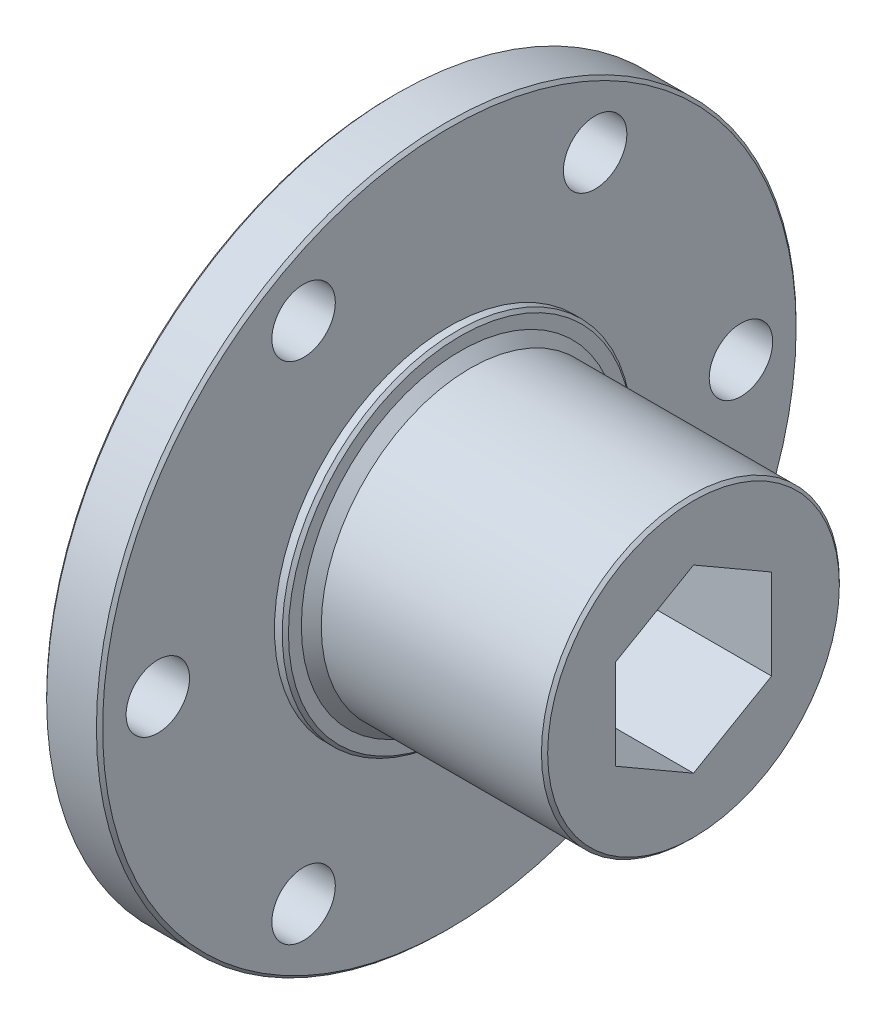
ISO-10303-21;
HEADER;
FILE_DESCRIPTION(('STEP AP214'),'2;1');
FILE_NAME('part.step','',(''),(''),'','','');
FILE_SCHEMA(('AUTOMOTIVE_DESIGN { 1 0 10303 214 1 1 1 1 }'));
ENDSEC;
DATA;
#1=APPLICATION_CONTEXT('core data for automotive mechanical design processes');
#2=APPLICATION_PROTOCOL_DEFINITION('international standard','automotive_design',2000,#1);
#3=PRODUCT_CONTEXT('',#1,'mechanical');
#4=PRODUCT('Part','Part','',(#3));
#5=PRODUCT_RELATED_PRODUCT_CATEGORY('part','',(#4));
#6=PRODUCT_DEFINITION_FORMATION('','',#4);
#7=PRODUCT_DEFINITION_CONTEXT('part definition',#1,'design');
#8=PRODUCT_DEFINITION('design','',#6,#7);
#9=PRODUCT_DEFINITION_SHAPE('','',#8);
#10=(LENGTH_UNIT() NAMED_UNIT(*) SI_UNIT(.MILLI.,.METRE.));
#11=(NAMED_UNIT(*) PLANE_ANGLE_UNIT() SI_UNIT($,.RADIAN.));
#12=(NAMED_UNIT(*) SI_UNIT($,.STERADIAN.) SOLID_ANGLE_UNIT());
#13=UNCERTAINTY_MEASURE_WITH_UNIT(LENGTH_MEASURE(1.E-05),#10,'distance_accuracy_value','');
#14=(GEOMETRIC_REPRESENTATION_CONTEXT(3) GLOBAL_UNCERTAINTY_ASSIGNED_CONTEXT((#13)) GLOBAL_UNIT_ASSIGNED_CONTEXT((#10,
#11,#12)) REPRESENTATION_CONTEXT('',''));
#15=CARTESIAN_POINT('',(0.,0.,0.));
#16=DIRECTION('',(0.,0.,1.));
#17=DIRECTION('',(1.,0.,0.));
#18=AXIS2_PLACEMENT_3D('',#15,#16,#17);
#19=CARTESIAN_POINT('',(-13.9240662460568,0.,0.));
#20=DIRECTION('',(-1.,0.,0.));
#21=DIRECTION('',(0.,0.,1.));
#22=AXIS2_PLACEMENT_3D('',#19,#20,#21);
#23=CYLINDRICAL_SURFACE('',#22,28.575);
#24=CARTESIAN_POINT('',(-18.2420662460566,0.,0.));
#25=DIRECTION('',(-1.,0.,0.));
#26=DIRECTION('',(0.,0.,1.));
#27=AXIS2_PLACEMENT_3D('',#24,#25,#26);
#28=CIRCLE('',#27,28.575);
#29=CARTESIAN_POINT('',(-18.2420662460566,0.,28.575));
#30=VERTEX_POINT('',#29);
#31=EDGE_CURVE('E169',#30,#30,#28,.F.);
#32=ORIENTED_EDGE('',*,*,#31,.T.);
#33=EDGE_LOOP('',(#32));
#34=FACE_BOUND('',#33,.T.);
#35=CARTESIAN_POINT('',(-14.1780662460569,0.,0.));
#36=DIRECTION('',(1.,0.,0.));
#37=DIRECTION('',(0.,0.,-1.));
#38=AXIS2_PLACEMENT_3D('',#35,#36,#37);
#39=CIRCLE('',#38,28.575);
#40=CARTESIAN_POINT('',(-14.1780662460569,0.,-28.575));
#41=VERTEX_POINT('',#40);
#42=EDGE_CURVE('E166',#41,#41,#39,.F.);
#43=ORIENTED_EDGE('',*,*,#42,.T.);
#44=EDGE_LOOP('',(#43));
#45=FACE_BOUND('',#44,.T.);
#46=ADVANCED_FACE('F32',(#34,#45),#23,.T.);
#47=CARTESIAN_POINT('',(-13.9240662460568,28.575,0.));
#48=DIRECTION('',(1.,0.,0.));
#49=DIRECTION('',(0.,0.,-1.));
#50=AXIS2_PLACEMENT_3D('',#47,#48,#49);
#51=PLANE('',#50);
#52=CARTESIAN_POINT('',(-13.9240662460568,0.,0.));
#53=DIRECTION('',(1.,0.,0.));
#54=DIRECTION('',(0.,0.,-1.));
#55=AXIS2_PLACEMENT_3D('',#52,#53,#54);
#56=CIRCLE('',#55,28.3209999999999);
#57=CARTESIAN_POINT('',(-13.9240662460568,0.,-28.3209999999999));
#58=VERTEX_POINT('',#57);
#59=EDGE_CURVE('E11',#58,#58,#56,.T.);
#60=ORIENTED_EDGE('',*,*,#59,.T.);
#61=EDGE_LOOP('',(#60));
#62=FACE_BOUND('',#61,.T.);
#63=CARTESIAN_POINT('',(-13.9240662460568,20.6222299276169,11.90625));
#64=DIRECTION('',(1.,0.,0.));
#65=DIRECTION('',(0.,0.,-1.));
#66=AXIS2_PLACEMENT_3D('',#63,#64,#65);
#67=CIRCLE('',#66,2.59080000000003);
#68=CARTESIAN_POINT('',(-13.9240662460568,20.6222299276169,9.31544999999998));
#69=VERTEX_POINT('',#68);
#70=EDGE_CURVE('E321',#69,#69,#67,.T.);
#71=ORIENTED_EDGE('',*,*,#70,.F.);
#72=EDGE_LOOP('',(#71));
#73=FACE_BOUND('',#72,.T.);
#74=CARTESIAN_POINT('',(-13.9240662460568,0.,-23.8125));
#75=DIRECTION('',(1.,0.,0.));
#76=DIRECTION('',(0.,0.,-1.));
#77=AXIS2_PLACEMENT_3D('',#74,#75,#76);
#78=CIRCLE('',#77,2.59080000000003);
#79=CARTESIAN_POINT('',(-13.9240662460568,0.,-26.4033));
#80=VERTEX_POINT('',#79);
#81=EDGE_CURVE('E326',#80,#80,#78,.T.);
#82=ORIENTED_EDGE('',*,*,#81,.F.);
#83=EDGE_LOOP('',(#82));
#84=FACE_BOUND('',#83,.T.);
#85=CARTESIAN_POINT('',(-13.9240662460568,-20.622229927617,11.9062499999999));
#86=DIRECTION('',(1.,0.,0.));
#87=DIRECTION('',(0.,0.,-1.));
#88=AXIS2_PLACEMENT_3D('',#85,#86,#87);
#89=CIRCLE('',#88,2.59080000000003);
#90=CARTESIAN_POINT('',(-13.9240662460568,-20.622229927617,9.31544999999992));
#91=VERTEX_POINT('',#90);
#92=EDGE_CURVE('E330',#91,#91,#89,.T.);
#93=ORIENTED_EDGE('',*,*,#92,.F.);
#94=EDGE_LOOP('',(#93));
#95=FACE_BOUND('',#94,.T.);
#96=CARTESIAN_POINT('',(-13.9240662460568,-20.6222299276169,-11.90625));
#97=DIRECTION('',(1.,0.,0.));
#98=DIRECTION('',(0.,0.,-1.));
#99=AXIS2_PLACEMENT_3D('',#96,#97,#98);
#100=CIRCLE('',#99,2.59080000000003);
#101=CARTESIAN_POINT('',(-13.9240662460568,-20.6222299276169,-14.4970500000001));
#102=VERTEX_POINT('',#101);
#103=EDGE_CURVE('E334',#102,#102,#100,.T.);
#104=ORIENTED_EDGE('',*,*,#103,.F.);
#105=EDGE_LOOP('',(#104));
#106=FACE_BOUND('',#105,.T.);
#107=CARTESIAN_POINT('',(-13.9240662460568,20.622229927617,-11.90625));
#108=DIRECTION('',(1.,0.,0.));
#109=DIRECTION('',(0.,0.,-1.));
#110=AXIS2_PLACEMENT_3D('',#107,#108,#109);
#111=CIRCLE('',#110,2.59080000000003);
#112=CARTESIAN_POINT('',(-13.9240662460568,20.622229927617,-14.49705));
#113=VERTEX_POINT('',#112);
#114=EDGE_CURVE('E338',#113,#113,#111,.T.);
#115=ORIENTED_EDGE('',*,*,#114,.F.);
#116=EDGE_LOOP('',(#115));
#117=FACE_BOUND('',#116,.T.);
#118=CARTESIAN_POINT('',(-13.9240662460568,0.,23.8125));
#119=DIRECTION('',(1.,0.,0.));
#120=DIRECTION('',(0.,0.,-1.));
#121=AXIS2_PLACEMENT_3D('',#118,#119,#120);
#122=CIRCLE('',#121,2.59080000000003);
#123=CARTESIAN_POINT('',(-13.9240662460568,0.,21.2217));
#124=VERTEX_POINT('',#123);
#125=EDGE_CURVE('E109',#124,#124,#122,.T.);
#126=ORIENTED_EDGE('',*,*,#125,.F.);
#127=EDGE_LOOP('',(#126));
#128=FACE_BOUND('',#127,.T.);
#129=CARTESIAN_POINT('',(-13.9240662460568,0.,0.));
#130=DIRECTION('',(1.,0.,0.));
#131=DIRECTION('',(0.,0.,-1.));
#132=AXIS2_PLACEMENT_3D('',#129,#130,#131);
#133=CIRCLE('',#132,14.2875);
#134=CARTESIAN_POINT('',(-13.9240662460568,0.,-14.2875));
#135=VERTEX_POINT('',#134);
#136=EDGE_CURVE('E148',#135,#135,#133,.T.);
#137=ORIENTED_EDGE('',*,*,#136,.F.);
#138=EDGE_LOOP('',(#137));
#139=FACE_BOUND('',#138,.T.);
#140=ADVANCED_FACE('F204',(#62,#73,#84,#95,#106,#117,#128,#139),#51,.T.);
#141=CARTESIAN_POINT('',(-18.4960662460568,0.,0.));
#142=DIRECTION('',(-1.,0.,0.));
#143=DIRECTION('',(0.,0.,1.));
#144=AXIS2_PLACEMENT_3D('',#141,#142,#143);
#145=PLANE('',#144);
#146=CARTESIAN_POINT('',(-18.4960662460568,0.,0.));
#147=DIRECTION('',(-1.,0.,0.));
#148=DIRECTION('',(0.,0.,1.));
#149=AXIS2_PLACEMENT_3D('',#146,#147,#148);
#150=CIRCLE('',#149,28.3209999999999);
#151=CARTESIAN_POINT('',(-18.4960662460568,0.,28.3209999999999));
#152=VERTEX_POINT('',#151);
#153=EDGE_CURVE('E163',#152,#152,#150,.T.);
#154=ORIENTED_EDGE('',*,*,#153,.T.);
#155=EDGE_LOOP('',(#154));
#156=FACE_BOUND('',#155,.T.);
#157=CARTESIAN_POINT('',(-18.4960662460568,20.6222299276169,11.90625));
#158=DIRECTION('',(-1.,0.,0.));
#159=DIRECTION('',(0.,0.,1.));
#160=AXIS2_PLACEMENT_3D('',#157,#158,#159);
#161=CIRCLE('',#160,2.59080000000003);
#162=CARTESIAN_POINT('',(-18.4960662460568,20.6222299276169,14.49705));
#163=VERTEX_POINT('',#162);
#164=EDGE_CURVE('E238',#163,#163,#161,.T.);
#165=ORIENTED_EDGE('',*,*,#164,.F.);
#166=EDGE_LOOP('',(#165));
#167=FACE_BOUND('',#166,.T.);
#168=CARTESIAN_POINT('',(-18.4960662460568,0.,-23.8125));
#169=DIRECTION('',(-1.,0.,0.));
#170=DIRECTION('',(0.,0.,1.));
#171=AXIS2_PLACEMENT_3D('',#168,#169,#170);
#172=CIRCLE('',#171,2.59080000000003);
#173=CARTESIAN_POINT('',(-18.4960662460568,0.,-21.2217));
#174=VERTEX_POINT('',#173);
#175=EDGE_CURVE('E242',#174,#174,#172,.T.);
#176=ORIENTED_EDGE('',*,*,#175,.F.);
#177=EDGE_LOOP('',(#176));
#178=FACE_BOUND('',#177,.T.);
#179=CARTESIAN_POINT('',(-18.4960662460568,-20.622229927617,11.9062499999999));
#180=DIRECTION('',(-1.,0.,0.));
#181=DIRECTION('',(0.,0.,1.));
#182=AXIS2_PLACEMENT_3D('',#179,#180,#181);
#183=CIRCLE('',#182,2.59080000000003);
#184=CARTESIAN_POINT('',(-18.4960662460568,-20.622229927617,14.49705));
#185=VERTEX_POINT('',#184);
#186=EDGE_CURVE('E246',#185,#185,#183,.T.);
#187=ORIENTED_EDGE('',*,*,#186,.F.);
#188=EDGE_LOOP('',(#187));
#189=FACE_BOUND('',#188,.T.);
#190=CARTESIAN_POINT('',(-18.4960662460568,-20.6222299276169,-11.90625));
#191=DIRECTION('',(-1.,0.,0.));
#192=DIRECTION('',(0.,0.,1.));
#193=AXIS2_PLACEMENT_3D('',#190,#191,#192);
#194=CIRCLE('',#193,2.59080000000003);
#195=CARTESIAN_POINT('',(-18.4960662460568,-20.6222299276169,-9.31545000000002));
#196=VERTEX_POINT('',#195);
#197=EDGE_CURVE('E250',#196,#196,#194,.T.);
#198=ORIENTED_EDGE('',*,*,#197,.F.);
#199=EDGE_LOOP('',(#198));
#200=FACE_BOUND('',#199,.T.);
#201=CARTESIAN_POINT('',(-18.4960662460568,20.622229927617,-11.90625));
#202=DIRECTION('',(-1.,0.,0.));
#203=DIRECTION('',(0.,0.,1.));
#204=AXIS2_PLACEMENT_3D('',#201,#202,#203);
#205=CIRCLE('',#204,2.59080000000003);
#206=CARTESIAN_POINT('',(-18.4960662460568,20.622229927617,-9.31544999999995));
#207=VERTEX_POINT('',#206);
#208=EDGE_CURVE('E254',#207,#207,#205,.T.);
#209=ORIENTED_EDGE('',*,*,#208,.F.);
#210=EDGE_LOOP('',(#209));
#211=FACE_BOUND('',#210,.T.);
#212=CARTESIAN_POINT('',(-18.4960662460568,0.,23.8125));
#213=DIRECTION('',(-1.,0.,0.));
#214=DIRECTION('',(0.,0.,1.));
#215=AXIS2_PLACEMENT_3D('',#212,#213,#214);
#216=CIRCLE('',#215,2.59080000000003);
#217=CARTESIAN_POINT('',(-18.4960662460568,0.,26.4033));
#218=VERTEX_POINT('',#217);
#219=EDGE_CURVE('E258',#218,#218,#216,.T.);
#220=ORIENTED_EDGE('',*,*,#219,.F.);
#221=EDGE_LOOP('',(#220));
#222=FACE_BOUND('',#221,.T.);
#223=CARTESIAN_POINT('',(-18.4960662460568,0.,0.));
#224=DIRECTION('',(-1.,0.,0.));
#225=DIRECTION('',(0.,0.,1.));
#226=AXIS2_PLACEMENT_3D('',#223,#224,#225);
#227=CIRCLE('',#226,14.2875);
#228=CARTESIAN_POINT('',(-18.4960662460568,0.,14.2875));
#229=VERTEX_POINT('',#228);
#230=EDGE_CURVE('E132',#229,#229,#227,.T.);
#231=ORIENTED_EDGE('',*,*,#230,.F.);
#232=EDGE_LOOP('',(#231));
#233=FACE_BOUND('',#232,.T.);
#234=ADVANCED_FACE('F210',(#156,#167,#178,#189,#200,#211,#222,#233),#145,.T.);
#235=CARTESIAN_POINT('',(-13.0350662460568,0.,0.));
#236=DIRECTION('',(-1.,0.,0.));
#237=DIRECTION('',(0.,0.,1.));
#238=AXIS2_PLACEMENT_3D('',#235,#236,#237);
#239=CYLINDRICAL_SURFACE('',#238,14.2875);
#240=CARTESIAN_POINT('',(-13.2890662460569,0.,0.));
#241=DIRECTION('',(1.,0.,0.));
#242=DIRECTION('',(0.,0.,-1.));
#243=AXIS2_PLACEMENT_3D('',#240,#241,#242);
#244=CIRCLE('',#243,14.2875);
#245=CARTESIAN_POINT('',(-13.2890662460569,0.,-14.2875));
#246=VERTEX_POINT('',#245);
#247=EDGE_CURVE('E40',#246,#246,#244,.F.);
#248=ORIENTED_EDGE('',*,*,#247,.T.);
#249=EDGE_LOOP('',(#248));
#250=FACE_BOUND('',#249,.T.);
#251=ORIENTED_EDGE('',*,*,#136,.T.);
#252=EDGE_LOOP('',(#251));
#253=FACE_BOUND('',#252,.T.);
#254=ADVANCED_FACE('F177',(#250,#253),#239,.T.);
#255=CARTESIAN_POINT('',(-13.0350662460568,0.,0.));
#256=DIRECTION('',(1.,0.,0.));
#257=DIRECTION('',(0.,0.,-1.));
#258=AXIS2_PLACEMENT_3D('',#255,#256,#257);
#259=PLANE('',#258);
#260=CARTESIAN_POINT('',(-13.0350662460568,0.,0.));
#261=DIRECTION('',(1.,0.,0.));
#262=DIRECTION('',(0.,0.,-1.));
#263=AXIS2_PLACEMENT_3D('',#260,#261,#262);
#264=CIRCLE('',#263,14.0334999999999);
#265=CARTESIAN_POINT('',(-13.0350662460568,0.,-14.0334999999999));
#266=VERTEX_POINT('',#265);
#267=EDGE_CURVE('E172',#266,#266,#264,.T.);
#268=ORIENTED_EDGE('',*,*,#267,.T.);
#269=EDGE_LOOP('',(#268));
#270=FACE_BOUND('',#269,.T.);
#271=CARTESIAN_POINT('',(-13.0350662460568,0.,0.));
#272=DIRECTION('',(1.,0.,0.));
#273=DIRECTION('',(0.,0.,-1.));
#274=AXIS2_PLACEMENT_3D('',#271,#272,#273);
#275=CIRCLE('',#274,12.9794);
#276=CARTESIAN_POINT('',(-13.0350662460568,0.,-12.9794));
#277=VERTEX_POINT('',#276);
#278=EDGE_CURVE('E142',#277,#277,#275,.T.);
#279=ORIENTED_EDGE('',*,*,#278,.F.);
#280=EDGE_LOOP('',(#279));
#281=FACE_BOUND('',#280,.T.);
#282=ADVANCED_FACE('F186',(#270,#281),#259,.T.);
#283=CARTESIAN_POINT('',(-13.0350662460568,0.,0.));
#284=DIRECTION('',(-1.,0.,0.));
#285=DIRECTION('',(0.,0.,-1.));
#286=AXIS2_PLACEMENT_3D('',#283,#284,#285);
#287=CONICAL_SURFACE('',#286,12.9794,0.785398163397434);
#288=CARTESIAN_POINT('',(-12.2222662460567,0.,0.));
#289=DIRECTION('',(1.,0.,0.));
#290=DIRECTION('',(0.,0.,-1.));
#291=AXIS2_PLACEMENT_3D('',#288,#289,#290);
#292=CIRCLE('',#291,12.1666);
#293=CARTESIAN_POINT('',(-12.2222662460567,0.,12.1666));
#294=VERTEX_POINT('',#293);
#295=EDGE_CURVE('E145',#294,#294,#292,.T.);
#296=ORIENTED_EDGE('',*,*,#295,.F.);
#297=EDGE_LOOP('',(#296));
#298=FACE_BOUND('',#297,.T.);
#299=ORIENTED_EDGE('',*,*,#278,.T.);
#300=EDGE_LOOP('',(#299));
#301=FACE_BOUND('',#300,.T.);
#302=ADVANCED_FACE('F189',(#298,#301),#287,.T.);
#303=CARTESIAN_POINT('',(6.01493375394323,0.,0.));
#304=DIRECTION('',(-1.,0.,0.));
#305=DIRECTION('',(0.,0.,1.));
#306=AXIS2_PLACEMENT_3D('',#303,#304,#305);
#307=CYLINDRICAL_SURFACE('',#306,12.1666);
#308=CARTESIAN_POINT('',(5.76093375394317,0.,0.));
#309=DIRECTION('',(1.,0.,0.));
#310=DIRECTION('',(0.,0.,-1.));
#311=AXIS2_PLACEMENT_3D('',#308,#309,#310);
#312=CIRCLE('',#311,12.1666);
#313=CARTESIAN_POINT('',(5.76093375394317,0.,12.1666));
#314=VERTEX_POINT('',#313);
#315=EDGE_CURVE('E160',#314,#314,#312,.F.);
#316=CARTESIAN_POINT('',(5.76093375394317,0.,12.1666));
#317=CARTESIAN_POINT('',(5.57360875394317,0.,12.1666));
#318=CARTESIAN_POINT('',(5.38628375394317,0.,12.1666));
#319=CARTESIAN_POINT('',(5.01163375394318,0.,12.1666));
#320=CARTESIAN_POINT('',(4.82430875394318,0.,12.1666));
#321=CARTESIAN_POINT('',(4.44965875394318,0.,12.1666));
#322=CARTESIAN_POINT('',(4.26233375394318,0.,12.1666));
#323=CARTESIAN_POINT('',(3.88768375394318,0.,12.1666));
#324=CARTESIAN_POINT('',(3.70035875394318,0.,12.1666));
#325=CARTESIAN_POINT('',(3.32570875394319,0.,12.1666));
#326=CARTESIAN_POINT('',(3.13838375394319,0.,12.1666));
#327=CARTESIAN_POINT('',(2.76373375394319,0.,12.1666));
#328=CARTESIAN_POINT('',(2.57640875394319,0.,12.1666));
#329=CARTESIAN_POINT('',(2.20175875394319,0.,12.1666));
#330=CARTESIAN_POINT('',(2.01443375394319,0.,12.1666));
#331=CARTESIAN_POINT('',(1.6397837539432,0.,12.1666));
#332=CARTESIAN_POINT('',(1.4524587539432,0.,12.1666));
#333=CARTESIAN_POINT('',(1.0778087539432,0.,12.1666));
#334=CARTESIAN_POINT('',(0.890483753943201,0.,12.1666));
#335=CARTESIAN_POINT('',(0.515833753943203,0.,12.1666));
#336=CARTESIAN_POINT('',(0.328508753943204,0.,12.1666));
#337=CARTESIAN_POINT('',(-0.0461412460567937,0.,12.1666));
#338=CARTESIAN_POINT('',(-0.233466246056793,0.,12.1666));
#339=CARTESIAN_POINT('',(-0.60811624605679,0.,12.1666));
#340=CARTESIAN_POINT('',(-0.795441246056789,0.,12.1666));
#341=CARTESIAN_POINT('',(-1.17009124605679,0.,12.1666));
#342=CARTESIAN_POINT('',(-1.35741624605678,0.,12.1666));
#343=CARTESIAN_POINT('',(-1.73206624605678,0.,12.1666));
#344=CARTESIAN_POINT('',(-1.91939124605678,0.,12.1666));
#345=CARTESIAN_POINT('',(-2.29404124605678,0.,12.1666));
#346=CARTESIAN_POINT('',(-2.48136624605678,0.,12.1666));
#347=CARTESIAN_POINT('',(-2.85601624605678,0.,12.1666));
#348=CARTESIAN_POINT('',(-3.04334124605677,0.,12.1666));
#349=CARTESIAN_POINT('',(-3.41799124605677,0.,12.1666));
#350=CARTESIAN_POINT('',(-3.60531624605677,0.,12.1666));
#351=CARTESIAN_POINT('',(-3.97996624605677,0.,12.1666));
#352=CARTESIAN_POINT('',(-4.16729124605677,0.,12.1666));
#353=CARTESIAN_POINT('',(-4.54194124605676,0.,12.1666));
#354=CARTESIAN_POINT('',(-4.72926624605676,0.,12.1666));
#355=CARTESIAN_POINT('',(-5.10391624605676,0.,12.1666));
#356=CARTESIAN_POINT('',(-5.29124124605676,0.,12.1666));
#357=CARTESIAN_POINT('',(-5.66589124605676,0.,12.1666));
#358=CARTESIAN_POINT('',(-5.85321624605676,0.,12.1666));
#359=CARTESIAN_POINT('',(-6.22786624605675,0.,12.1666));
#360=CARTESIAN_POINT('',(-6.41519124605675,0.,12.1666));
#361=CARTESIAN_POINT('',(-6.78984124605675,0.,12.1666));
#362=CARTESIAN_POINT('',(-6.97716624605675,0.,12.1666));
#363=CARTESIAN_POINT('',(-7.35181624605675,0.,12.1666));
#364=CARTESIAN_POINT('',(-7.53914124605675,0.,12.1666));
#365=CARTESIAN_POINT('',(-7.91379124605674,0.,12.1666));
#366=CARTESIAN_POINT('',(-8.10111624605674,0.,12.1666));
#367=CARTESIAN_POINT('',(-8.47576624605674,0.,12.1666));
#368=CARTESIAN_POINT('',(-8.66309124605674,0.,12.1666));
#369=CARTESIAN_POINT('',(-9.03774124605674,0.,12.1666));
#370=CARTESIAN_POINT('',(-9.22506624605674,0.,12.1666));
#371=CARTESIAN_POINT('',(-9.59971624605673,0.,12.1666));
#372=CARTESIAN_POINT('',(-9.78704124605673,0.,12.1666));
#373=CARTESIAN_POINT('',(-10.1616912460567,0.,12.1666));
#374=CARTESIAN_POINT('',(-10.3490162460567,0.,12.1666));
#375=CARTESIAN_POINT('',(-10.7236662460567,0.,12.1666));
#376=CARTESIAN_POINT('',(-10.9109912460567,0.,12.1666));
#377=CARTESIAN_POINT('',(-11.2856412460567,0.,12.1666));
#378=CARTESIAN_POINT('',(-11.4729662460567,0.,12.1666));
#379=CARTESIAN_POINT('',(-11.8476162460567,0.,12.1666));
#380=CARTESIAN_POINT('',(-12.0349412460567,0.,12.1666));
#381=CARTESIAN_POINT('',(-12.2222662460567,0.,12.1666));
#382=B_SPLINE_CURVE_WITH_KNOTS('',3,(#316,#317,#318,#319,#320,#321,#322,#323,#324,#325,#326,
#327,#328,#329,#330,#331,#332,#333,#334,#335,#336,#337,#338,#339,#340,#341,#342,#343,#344,#345,
#346,#347,#348,#349,#350,#351,#352,#353,#354,#355,#356,#357,#358,#359,#360,#361,#362,#363,#364,
#365,#366,#367,#368,#369,#370,#371,#372,#373,#374,#375,#376,#377,#378,#379,#380,#381),
.UNSPECIFIED.,.F.,.F.,(4,2,2,2,2,2,2,2,2,2,2,2,2,2,2,2,2,2,2,2,2,2,2,2,2,2,2,2,2,2,2,2,4),(0.,
0.561974999999996,1.12394999999999,1.68592499999999,2.24789999999999,2.80987499999998,
3.37184999999998,3.93382499999997,4.49579999999997,5.05777499999997,5.61974999999997,
6.18172499999996,6.74369999999996,7.30567499999995,7.86764999999995,8.42962499999995,
8.99159999999994,9.55357499999994,10.1155499999999,10.6775249999999,11.2394999999999,
11.8014749999999,12.3634499999999,12.9254249999999,13.4873999999999,14.0493749999999,
14.6113499999999,15.1733249999999,15.7352999999999,16.2972749999999,16.8592499999999,
17.4212249999999,17.9831999999999),.UNSPECIFIED.);
#383=EDGE_CURVE('BSEAM194',#314,#294,#382,.T.);
#384=ORIENTED_EDGE('',*,*,#315,.T.);
#385=ORIENTED_EDGE('',*,*,#295,.T.);
#386=ORIENTED_EDGE('',*,*,#383,.T.);
#387=ORIENTED_EDGE('',*,*,#383,.F.);
#388=EDGE_LOOP('',(#384,#386,#385,#387));
#389=FACE_BOUND('',#388,.T.);
#390=ADVANCED_FACE('F194',(#389),#307,.T.);
#391=CARTESIAN_POINT('',(6.01493375394323,0.,0.));
#392=DIRECTION('',(1.,0.,0.));
#393=DIRECTION('',(0.,0.,-1.));
#394=AXIS2_PLACEMENT_3D('',#391,#392,#393);
#395=PLANE('',#394);
#396=CARTESIAN_POINT('',(6.01493375394323,0.,0.));
#397=DIRECTION('',(1.,0.,0.));
#398=DIRECTION('',(0.,0.,-1.));
#399=AXIS2_PLACEMENT_3D('',#396,#397,#398);
#400=CIRCLE('',#399,11.9125999999999);
#401=CARTESIAN_POINT('',(6.01493375394323,0.,-11.9125999999999));
#402=VERTEX_POINT('',#401);
#403=EDGE_CURVE('E157',#402,#402,#400,.T.);
#404=ORIENTED_EDGE('',*,*,#403,.T.);
#405=EDGE_LOOP('',(#404));
#406=FACE_BOUND('',#405,.T.);
#407=DIRECTION('',(0.,0.500000000000001,-0.866025403784438));
#408=VECTOR('',#407,1.);
#409=CARTESIAN_POINT('',(6.01493375394323,3.68081890619155,6.3754));
#410=LINE('',#409,#408);
#411=CARTESIAN_POINT('',(6.01493375394323,3.68081890619155,6.3754));
#412=VERTEX_POINT('',#411);
#413=CARTESIAN_POINT('',(6.01493375394323,7.3616578123831,0.));
#414=VERTEX_POINT('',#413);
#415=EDGE_CURVE('E87',#412,#414,#410,.T.);
#416=ORIENTED_EDGE('',*,*,#415,.T.);
#417=DIRECTION('',(0.,-0.500000000000001,-0.866025403784438));
#418=VECTOR('',#417,1.);
#419=CARTESIAN_POINT('',(6.01493375394323,7.3616578123831,0.));
#420=LINE('',#419,#418);
#421=CARTESIAN_POINT('',(6.01493375394323,3.68081890619154,-6.37539999999999));
#422=VERTEX_POINT('',#421);
#423=EDGE_CURVE('E96',#414,#422,#420,.T.);
#424=ORIENTED_EDGE('',*,*,#423,.T.);
#425=DIRECTION('',(0.,-1.,0.));
#426=VECTOR('',#425,1.);
#427=CARTESIAN_POINT('',(6.01493375394323,3.68081890619155,-6.37539999999999));
#428=LINE('',#427,#426);
#429=CARTESIAN_POINT('',(6.01493375394323,-3.68085890619153,-6.37539999999999));
#430=VERTEX_POINT('',#429);
#431=EDGE_CURVE('E47',#422,#430,#428,.T.);
#432=ORIENTED_EDGE('',*,*,#431,.T.);
#433=DIRECTION('',(0.,-0.500000000000001,0.866025403784438));
#434=VECTOR('',#433,1.);
#435=CARTESIAN_POINT('',(6.01493375394323,-3.68085890619153,-6.37539999999999));
#436=LINE('',#435,#434);
#437=CARTESIAN_POINT('',(6.01493375394323,-7.36169781238308,0.));
#438=VERTEX_POINT('',#437);
#439=EDGE_CURVE('E113',#430,#438,#436,.T.);
#440=ORIENTED_EDGE('',*,*,#439,.T.);
#441=DIRECTION('',(0.,0.500000000000001,0.866025403784438));
#442=VECTOR('',#441,1.);
#443=CARTESIAN_POINT('',(6.01493375394323,-7.36169781238308,0.));
#444=LINE('',#443,#442);
#445=CARTESIAN_POINT('',(6.01493375394323,-3.68085890619153,6.3754));
#446=VERTEX_POINT('',#445);
#447=EDGE_CURVE('E116',#438,#446,#444,.T.);
#448=ORIENTED_EDGE('',*,*,#447,.T.);
#449=DIRECTION('',(0.,1.,0.));
#450=VECTOR('',#449,1.);
#451=CARTESIAN_POINT('',(6.01493375394323,-3.68085890619153,6.3754));
#452=LINE('',#451,#450);
#453=EDGE_CURVE('E93',#446,#412,#452,.T.);
#454=ORIENTED_EDGE('',*,*,#453,.T.);
#455=EDGE_LOOP('',(#416,#424,#432,#440,#448,#454));
#456=FACE_BOUND('',#455,.T.);
#457=ADVANCED_FACE('F100',(#406,#456),#395,.T.);
#458=CARTESIAN_POINT('',(-19.3850662460568,0.,0.));
#459=DIRECTION('',(1.,0.,0.));
#460=DIRECTION('',(0.,0.,-1.));
#461=AXIS2_PLACEMENT_3D('',#458,#459,#460);
#462=CYLINDRICAL_SURFACE('',#461,14.2875);
#463=CARTESIAN_POINT('',(-19.1310662460567,0.,0.));
#464=DIRECTION('',(-1.,0.,0.));
#465=DIRECTION('',(0.,0.,1.));
#466=AXIS2_PLACEMENT_3D('',#463,#464,#465);
#467=CIRCLE('',#466,14.2875);
#468=CARTESIAN_POINT('',(-19.1310662460567,0.,14.2875));
#469=VERTEX_POINT('',#468);
#470=EDGE_CURVE('E154',#469,#469,#467,.F.);
#471=ORIENTED_EDGE('',*,*,#470,.T.);
#472=EDGE_LOOP('',(#471));
#473=FACE_BOUND('',#472,.T.);
#474=ORIENTED_EDGE('',*,*,#230,.T.);
#475=EDGE_LOOP('',(#474));
#476=FACE_BOUND('',#475,.T.);
#477=ADVANCED_FACE('F261',(#473,#476),#462,.T.);
#478=CARTESIAN_POINT('',(-19.3850662460568,0.,0.));
#479=DIRECTION('',(-1.,0.,0.));
#480=DIRECTION('',(0.,0.,1.));
#481=AXIS2_PLACEMENT_3D('',#478,#479,#480);
#482=PLANE('',#481);
#483=CARTESIAN_POINT('',(-19.3850662460568,0.,0.));
#484=DIRECTION('',(-1.,0.,0.));
#485=DIRECTION('',(0.,0.,1.));
#486=AXIS2_PLACEMENT_3D('',#483,#484,#485);
#487=CIRCLE('',#486,14.0334999999999);
#488=CARTESIAN_POINT('',(-19.3850662460568,0.,14.0334999999999));
#489=VERTEX_POINT('',#488);
#490=EDGE_CURVE('E151',#489,#489,#487,.T.);
#491=ORIENTED_EDGE('',*,*,#490,.T.);
#492=EDGE_LOOP('',(#491));
#493=FACE_BOUND('',#492,.T.);
#494=DIRECTION('',(0.,0.500000000000001,-0.866025403784438));
#495=VECTOR('',#494,1.);
#496=CARTESIAN_POINT('',(-19.3850662460568,3.68081890619155,6.3754));
#497=LINE('',#496,#495);
#498=CARTESIAN_POINT('',(-19.3850662460568,3.68081890619155,6.3754));
#499=VERTEX_POINT('',#498);
#500=CARTESIAN_POINT('',(-19.3850662460568,7.36165781238309,0.));
#501=VERTEX_POINT('',#500);
#502=EDGE_CURVE('E55',#499,#501,#497,.T.);
#503=ORIENTED_EDGE('',*,*,#502,.F.);
#504=DIRECTION('',(0.,1.,0.));
#505=VECTOR('',#504,1.);
#506=CARTESIAN_POINT('',(-19.3850662460568,-3.68085890619153,6.3754));
#507=LINE('',#506,#505);
#508=CARTESIAN_POINT('',(-19.3850662460568,-3.68085890619153,6.3754));
#509=VERTEX_POINT('',#508);
#510=EDGE_CURVE('E103',#509,#499,#507,.T.);
#511=ORIENTED_EDGE('',*,*,#510,.F.);
#512=DIRECTION('',(0.,0.500000000000001,0.866025403784438));
#513=VECTOR('',#512,1.);
#514=CARTESIAN_POINT('',(-19.3850662460568,-7.36169781238308,0.));
#515=LINE('',#514,#513);
#516=CARTESIAN_POINT('',(-19.3850662460568,-7.36169781238308,0.));
#517=VERTEX_POINT('',#516);
#518=EDGE_CURVE('E106',#517,#509,#515,.T.);
#519=ORIENTED_EDGE('',*,*,#518,.F.);
#520=DIRECTION('',(0.,-0.500000000000001,0.866025403784438));
#521=VECTOR('',#520,1.);
#522=CARTESIAN_POINT('',(-19.3850662460568,-3.68085890619153,-6.37539999999999));
#523=LINE('',#522,#521);
#524=CARTESIAN_POINT('',(-19.3850662460568,-3.68085890619153,-6.37539999999999));
#525=VERTEX_POINT('',#524);
#526=EDGE_CURVE('E125',#525,#517,#523,.T.);
#527=ORIENTED_EDGE('',*,*,#526,.F.);
#528=DIRECTION('',(0.,-1.,0.));
#529=VECTOR('',#528,1.);
#530=CARTESIAN_POINT('',(-19.3850662460568,3.68081890619155,-6.37539999999999));
#531=LINE('',#530,#529);
#532=CARTESIAN_POINT('',(-19.3850662460568,3.68081890619155,-6.37539999999999));
#533=VERTEX_POINT('',#532);
#534=EDGE_CURVE('E122',#533,#525,#531,.T.);
#535=ORIENTED_EDGE('',*,*,#534,.F.);
#536=DIRECTION('',(0.,-0.500000000000001,-0.866025403784438));
#537=VECTOR('',#536,1.);
#538=CARTESIAN_POINT('',(-19.3850662460568,7.3616578123831,0.));
#539=LINE('',#538,#537);
#540=EDGE_CURVE('E120',#501,#533,#539,.T.);
#541=ORIENTED_EDGE('',*,*,#540,.F.);
#542=EDGE_LOOP('',(#503,#511,#519,#527,#535,#541));
#543=FACE_BOUND('',#542,.T.);
#544=ADVANCED_FACE('F263',(#493,#543),#482,.T.);
#545=CARTESIAN_POINT('',(6.01493375394323,3.68081890619155,6.3754));
#546=DIRECTION('',(0.,0.866025403784438,0.500000000000001));
#547=DIRECTION('',(0.,-0.500000000000001,0.866025403784438));
#548=AXIS2_PLACEMENT_3D('',#545,#546,#547);
#549=PLANE('',#548);
#550=ORIENTED_EDGE('',*,*,#502,.T.);
#551=DIRECTION('',(-1.,0.,0.));
#552=VECTOR('',#551,1.);
#553=CARTESIAN_POINT('',(6.01493375394323,7.3616578123831,0.));
#554=LINE('',#553,#552);
#555=EDGE_CURVE('E83',#414,#501,#554,.T.);
#556=ORIENTED_EDGE('',*,*,#555,.F.);
#557=ORIENTED_EDGE('',*,*,#415,.F.);
#558=DIRECTION('',(-1.,0.,0.));
#559=VECTOR('',#558,1.);
#560=CARTESIAN_POINT('',(6.01493375394323,3.68081890619155,6.3754));
#561=LINE('',#560,#559);
#562=EDGE_CURVE('E130',#412,#499,#561,.T.);
#563=ORIENTED_EDGE('',*,*,#562,.T.);
#564=EDGE_LOOP('',(#550,#556,#557,#563));
#565=FACE_BOUND('',#564,.T.);
#566=ADVANCED_FACE('F85',(#565),#549,.F.);
#567=CARTESIAN_POINT('',(6.01493375394323,-3.68085890619153,6.3754));
#568=DIRECTION('',(0.,0.,1.));
#569=DIRECTION('',(0.,-1.,0.));
#570=AXIS2_PLACEMENT_3D('',#567,#568,#569);
#571=PLANE('',#570);
#572=ORIENTED_EDGE('',*,*,#510,.T.);
#573=ORIENTED_EDGE('',*,*,#562,.F.);
#574=ORIENTED_EDGE('',*,*,#453,.F.);
#575=DIRECTION('',(-1.,0.,0.));
#576=VECTOR('',#575,1.);
#577=CARTESIAN_POINT('',(6.01493375394323,-3.68085890619153,6.3754));
#578=LINE('',#577,#576);
#579=EDGE_CURVE('E133',#446,#509,#578,.T.);
#580=ORIENTED_EDGE('',*,*,#579,.T.);
#581=EDGE_LOOP('',(#572,#573,#574,#580));
#582=FACE_BOUND('',#581,.T.);
#583=ADVANCED_FACE('F277',(#582),#571,.F.);
#584=CARTESIAN_POINT('',(6.01493375394323,-7.36169781238308,0.));
#585=DIRECTION('',(0.,-0.866025403784438,0.500000000000001));
#586=DIRECTION('',(0.,-0.500000000000001,-0.866025403784438));
#587=AXIS2_PLACEMENT_3D('',#584,#585,#586);
#588=PLANE('',#587);
#589=ORIENTED_EDGE('',*,*,#518,.T.);
#590=ORIENTED_EDGE('',*,*,#579,.F.);
#591=ORIENTED_EDGE('',*,*,#447,.F.);
#592=DIRECTION('',(-1.,0.,0.));
#593=VECTOR('',#592,1.);
#594=CARTESIAN_POINT('',(6.01493375394323,-7.36169781238308,0.));
#595=LINE('',#594,#593);
#596=EDGE_CURVE('E135',#438,#517,#595,.T.);
#597=ORIENTED_EDGE('',*,*,#596,.T.);
#598=EDGE_LOOP('',(#589,#590,#591,#597));
#599=FACE_BOUND('',#598,.T.);
#600=ADVANCED_FACE('F287',(#599),#588,.F.);
#601=CARTESIAN_POINT('',(6.01493375394323,-3.68085890619153,-6.37539999999999));
#602=DIRECTION('',(0.,-0.866025403784438,-0.500000000000001));
#603=DIRECTION('',(0.,0.500000000000001,-0.866025403784438));
#604=AXIS2_PLACEMENT_3D('',#601,#602,#603);
#605=PLANE('',#604);
#606=ORIENTED_EDGE('',*,*,#526,.T.);
#607=ORIENTED_EDGE('',*,*,#596,.F.);
#608=ORIENTED_EDGE('',*,*,#439,.F.);
#609=DIRECTION('',(-1.,0.,0.));
#610=VECTOR('',#609,1.);
#611=CARTESIAN_POINT('',(6.01493375394323,-3.68085890619153,-6.37539999999999));
#612=LINE('',#611,#610);
#613=EDGE_CURVE('E137',#430,#525,#612,.T.);
#614=ORIENTED_EDGE('',*,*,#613,.T.);
#615=EDGE_LOOP('',(#606,#607,#608,#614));
#616=FACE_BOUND('',#615,.T.);
#617=ADVANCED_FACE('F284',(#616),#605,.F.);
#618=CARTESIAN_POINT('',(6.01493375394323,3.68081890619155,-6.37539999999999));
#619=DIRECTION('',(0.,0.,-1.));
#620=DIRECTION('',(0.,1.,0.));
#621=AXIS2_PLACEMENT_3D('',#618,#619,#620);
#622=PLANE('',#621);
#623=ORIENTED_EDGE('',*,*,#534,.T.);
#624=ORIENTED_EDGE('',*,*,#613,.F.);
#625=ORIENTED_EDGE('',*,*,#431,.F.);
#626=DIRECTION('',(-1.,0.,0.));
#627=VECTOR('',#626,1.);
#628=CARTESIAN_POINT('',(6.01493375394323,3.68081890619155,-6.37539999999999));
#629=LINE('',#628,#627);
#630=EDGE_CURVE('E92',#422,#533,#629,.T.);
#631=ORIENTED_EDGE('',*,*,#630,.T.);
#632=EDGE_LOOP('',(#623,#624,#625,#631));
#633=FACE_BOUND('',#632,.T.);
#634=ADVANCED_FACE('F281',(#633),#622,.F.);
#635=CARTESIAN_POINT('',(6.01493375394323,7.3616578123831,0.));
#636=DIRECTION('',(0.,0.866025403784438,-0.500000000000001));
#637=DIRECTION('',(0.,0.500000000000001,0.866025403784438));
#638=AXIS2_PLACEMENT_3D('',#635,#636,#637);
#639=PLANE('',#638);
#640=ORIENTED_EDGE('',*,*,#540,.T.);
#641=ORIENTED_EDGE('',*,*,#630,.F.);
#642=ORIENTED_EDGE('',*,*,#423,.F.);
#643=ORIENTED_EDGE('',*,*,#555,.T.);
#644=EDGE_LOOP('',(#640,#641,#642,#643));
#645=FACE_BOUND('',#644,.T.);
#646=ADVANCED_FACE('F97',(#645),#639,.F.);
#647=CARTESIAN_POINT('',(-18.4960662460568,0.,23.8125));
#648=DIRECTION('',(-1.,0.,0.));
#649=DIRECTION('',(0.,0.,1.));
#650=AXIS2_PLACEMENT_3D('',#647,#648,#649);
#651=CYLINDRICAL_SURFACE('',#650,2.59080000000003);
#652=ORIENTED_EDGE('',*,*,#125,.T.);
#653=EDGE_LOOP('',(#652));
#654=FACE_BOUND('',#653,.T.);
#655=ORIENTED_EDGE('',*,*,#219,.T.);
#656=EDGE_LOOP('',(#655));
#657=FACE_BOUND('',#656,.T.);
#658=ADVANCED_FACE('F280',(#654,#657),#651,.F.);
#659=CARTESIAN_POINT('',(-18.4960662460568,20.622229927617,-11.90625));
#660=DIRECTION('',(-1.,0.,0.));
#661=DIRECTION('',(0.,0.,1.));
#662=AXIS2_PLACEMENT_3D('',#659,#660,#661);
#663=CYLINDRICAL_SURFACE('',#662,2.59080000000003);
#664=ORIENTED_EDGE('',*,*,#114,.T.);
#665=EDGE_LOOP('',(#664));
#666=FACE_BOUND('',#665,.T.);
#667=ORIENTED_EDGE('',*,*,#208,.T.);
#668=EDGE_LOOP('',(#667));
#669=FACE_BOUND('',#668,.T.);
#670=ADVANCED_FACE('F297',(#666,#669),#663,.F.);
#671=CARTESIAN_POINT('',(-18.4960662460568,-20.6222299276169,-11.90625));
#672=DIRECTION('',(-1.,0.,0.));
#673=DIRECTION('',(0.,0.,1.));
#674=AXIS2_PLACEMENT_3D('',#671,#672,#673);
#675=CYLINDRICAL_SURFACE('',#674,2.59080000000003);
#676=ORIENTED_EDGE('',*,*,#103,.T.);
#677=EDGE_LOOP('',(#676));
#678=FACE_BOUND('',#677,.T.);
#679=ORIENTED_EDGE('',*,*,#197,.T.);
#680=EDGE_LOOP('',(#679));
#681=FACE_BOUND('',#680,.T.);
#682=ADVANCED_FACE('F301',(#678,#681),#675,.F.);
#683=CARTESIAN_POINT('',(-18.4960662460568,-20.622229927617,11.9062499999999));
#684=DIRECTION('',(-1.,0.,0.));
#685=DIRECTION('',(0.,0.,1.));
#686=AXIS2_PLACEMENT_3D('',#683,#684,#685);
#687=CYLINDRICAL_SURFACE('',#686,2.59080000000003);
#688=ORIENTED_EDGE('',*,*,#92,.T.);
#689=EDGE_LOOP('',(#688));
#690=FACE_BOUND('',#689,.T.);
#691=ORIENTED_EDGE('',*,*,#186,.T.);
#692=EDGE_LOOP('',(#691));
#693=FACE_BOUND('',#692,.T.);
#694=ADVANCED_FACE('F305',(#690,#693),#687,.F.);
#695=CARTESIAN_POINT('',(-18.4960662460568,0.,-23.8125));
#696=DIRECTION('',(-1.,0.,0.));
#697=DIRECTION('',(0.,0.,1.));
#698=AXIS2_PLACEMENT_3D('',#695,#696,#697);
#699=CYLINDRICAL_SURFACE('',#698,2.59080000000003);
#700=ORIENTED_EDGE('',*,*,#81,.T.);
#701=EDGE_LOOP('',(#700));
#702=FACE_BOUND('',#701,.T.);
#703=ORIENTED_EDGE('',*,*,#175,.T.);
#704=EDGE_LOOP('',(#703));
#705=FACE_BOUND('',#704,.T.);
#706=ADVANCED_FACE('F309',(#702,#705),#699,.F.);
#707=CARTESIAN_POINT('',(-18.4960662460568,20.6222299276169,11.90625));
#708=DIRECTION('',(-1.,0.,0.));
#709=DIRECTION('',(0.,0.,1.));
#710=AXIS2_PLACEMENT_3D('',#707,#708,#709);
#711=CYLINDRICAL_SURFACE('',#710,2.59080000000003);
#712=ORIENTED_EDGE('',*,*,#70,.T.);
#713=EDGE_LOOP('',(#712));
#714=FACE_BOUND('',#713,.T.);
#715=ORIENTED_EDGE('',*,*,#164,.T.);
#716=EDGE_LOOP('',(#715));
#717=FACE_BOUND('',#716,.T.);
#718=ADVANCED_FACE('F220',(#714,#717),#711,.F.);
#719=CARTESIAN_POINT('',(-19.3850662460568,0.,0.));
#720=DIRECTION('',(1.,0.,0.));
#721=DIRECTION('',(0.,0.,-1.));
#722=AXIS2_PLACEMENT_3D('',#719,#720,#721);
#723=CONICAL_SURFACE('',#722,14.0334999999999,0.785398163397448);
#724=ORIENTED_EDGE('',*,*,#470,.F.);
#725=EDGE_LOOP('',(#724));
#726=FACE_BOUND('',#725,.T.);
#727=ORIENTED_EDGE('',*,*,#490,.F.);
#728=EDGE_LOOP('',(#727));
#729=FACE_BOUND('',#728,.T.);
#730=ADVANCED_FACE('F216',(#726,#729),#723,.T.);
#731=CARTESIAN_POINT('',(6.01493375394323,0.,0.));
#732=DIRECTION('',(-1.,0.,0.));
#733=DIRECTION('',(0.,0.,1.));
#734=AXIS2_PLACEMENT_3D('',#731,#732,#733);
#735=CONICAL_SURFACE('',#734,11.9125999999999,0.785398163397452);
#736=ORIENTED_EDGE('',*,*,#315,.F.);
#737=EDGE_LOOP('',(#736));
#738=FACE_BOUND('',#737,.T.);
#739=ORIENTED_EDGE('',*,*,#403,.F.);
#740=EDGE_LOOP('',(#739));
#741=FACE_BOUND('',#740,.T.);
#742=ADVANCED_FACE('F219',(#738,#741),#735,.T.);
#743=CARTESIAN_POINT('',(-18.4960662460568,0.,0.));
#744=DIRECTION('',(1.,0.,0.));
#745=DIRECTION('',(0.,0.,-1.));
#746=AXIS2_PLACEMENT_3D('',#743,#744,#745);
#747=CONICAL_SURFACE('',#746,28.3209999999999,0.785398163397455);
#748=ORIENTED_EDGE('',*,*,#31,.F.);
#749=EDGE_LOOP('',(#748));
#750=FACE_BOUND('',#749,.T.);
#751=ORIENTED_EDGE('',*,*,#153,.F.);
#752=EDGE_LOOP('',(#751));
#753=FACE_BOUND('',#752,.T.);
#754=ADVANCED_FACE('F183',(#750,#753),#747,.T.);
#755=CARTESIAN_POINT('',(-13.0350662460568,0.,0.));
#756=DIRECTION('',(-1.,0.,0.));
#757=DIRECTION('',(0.,0.,1.));
#758=AXIS2_PLACEMENT_3D('',#755,#756,#757);
#759=CONICAL_SURFACE('',#758,14.0334999999999,0.785398163397445);
#760=ORIENTED_EDGE('',*,*,#247,.F.);
#761=EDGE_LOOP('',(#760));
#762=FACE_BOUND('',#761,.T.);
#763=ORIENTED_EDGE('',*,*,#267,.F.);
#764=EDGE_LOOP('',(#763));
#765=FACE_BOUND('',#764,.T.);
#766=ADVANCED_FACE('F180',(#762,#765),#759,.T.);
#767=CARTESIAN_POINT('',(-14.1780662460569,0.,0.));
#768=DIRECTION('',(-1.,0.,0.));
#769=DIRECTION('',(0.,0.,1.));
#770=AXIS2_PLACEMENT_3D('',#767,#768,#769);
#771=CONICAL_SURFACE('',#770,28.575,0.785398163397455);
#772=ORIENTED_EDGE('',*,*,#59,.F.);
#773=EDGE_LOOP('',(#772));
#774=FACE_BOUND('',#773,.T.);
#775=ORIENTED_EDGE('',*,*,#42,.F.);
#776=EDGE_LOOP('',(#775));
#777=FACE_BOUND('',#776,.T.);
#778=ADVANCED_FACE('F34',(#774,#777),#771,.T.);
#779=CLOSED_SHELL('',(#46,#140,#234,#254,#282,#302,#390,#457,#477,#544,#566,#583,#600,#617,#634,
#646,#658,#670,#682,#694,#706,#718,#730,#742,#754,#766,#778));
#780=MANIFOLD_SOLID_BREP('B2',#779);
#781=ADVANCED_BREP_SHAPE_REPRESENTATION('',(#18,#780),#14);
#782=SHAPE_DEFINITION_REPRESENTATION(#9,#781);
ENDSEC;
END-ISO-10303-21;
